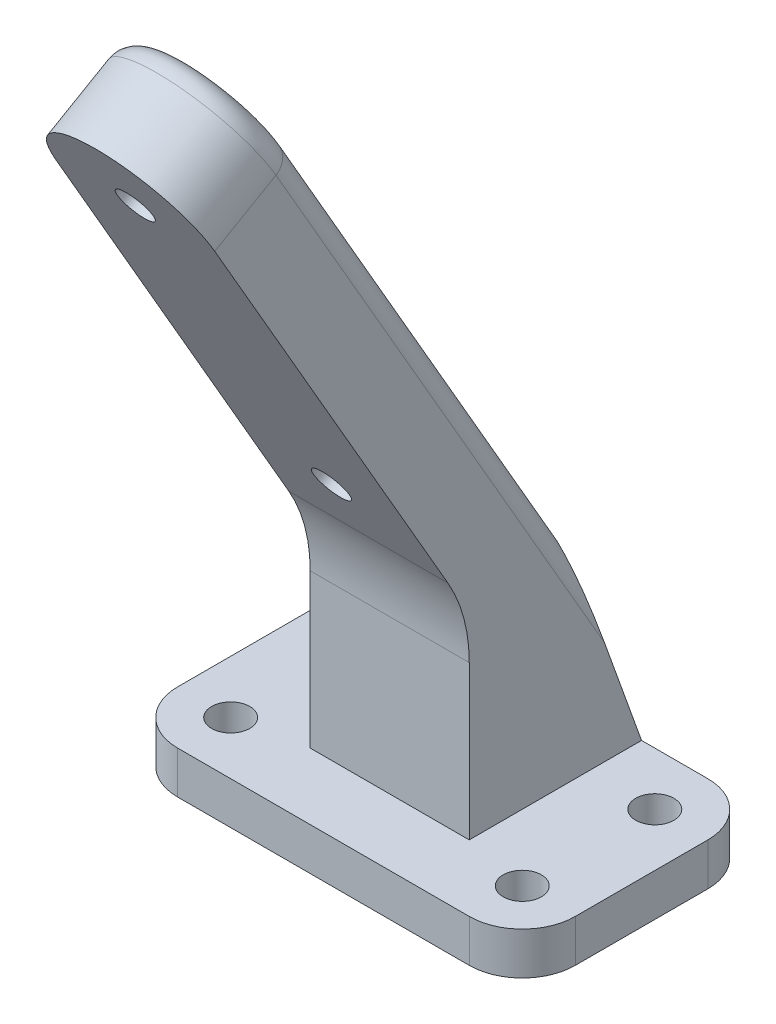
ISO-10303-21;
HEADER;
FILE_DESCRIPTION(('STEP AP214'),'2;1');
FILE_NAME('part.step','',(''),(''),'','','');
FILE_SCHEMA(('AUTOMOTIVE_DESIGN { 1 0 10303 214 1 1 1 1 }'));
ENDSEC;
DATA;
#1=APPLICATION_CONTEXT('core data for automotive mechanical design processes');
#2=APPLICATION_PROTOCOL_DEFINITION('international standard','automotive_design',2000,#1);
#3=PRODUCT_CONTEXT('',#1,'mechanical');
#4=PRODUCT('Part','Part','',(#3));
#5=PRODUCT_RELATED_PRODUCT_CATEGORY('part','',(#4));
#6=PRODUCT_DEFINITION_FORMATION('','',#4);
#7=PRODUCT_DEFINITION_CONTEXT('part definition',#1,'design');
#8=PRODUCT_DEFINITION('design','',#6,#7);
#9=PRODUCT_DEFINITION_SHAPE('','',#8);
#10=(LENGTH_UNIT() NAMED_UNIT(*) SI_UNIT(.MILLI.,.METRE.));
#11=(NAMED_UNIT(*) PLANE_ANGLE_UNIT() SI_UNIT($,.RADIAN.));
#12=(NAMED_UNIT(*) SI_UNIT($,.STERADIAN.) SOLID_ANGLE_UNIT());
#13=UNCERTAINTY_MEASURE_WITH_UNIT(LENGTH_MEASURE(1.E-05),#10,'distance_accuracy_value','');
#14=(GEOMETRIC_REPRESENTATION_CONTEXT(3) GLOBAL_UNCERTAINTY_ASSIGNED_CONTEXT((#13)) GLOBAL_UNIT_ASSIGNED_CONTEXT((#10,
#11,#12)) REPRESENTATION_CONTEXT('',''));
#15=CARTESIAN_POINT('',(0.,0.,0.));
#16=DIRECTION('',(0.,0.,1.));
#17=DIRECTION('',(1.,0.,0.));
#18=AXIS2_PLACEMENT_3D('',#15,#16,#17);
#19=CARTESIAN_POINT('',(11.25,22.5,-16.25));
#20=DIRECTION('',(0.,0.,1.));
#21=DIRECTION('',(1.,0.,0.));
#22=AXIS2_PLACEMENT_3D('',#19,#20,#21);
#23=PLANE('',#22);
#24=DIRECTION('',(0.,-1.,0.));
#25=VECTOR('',#24,1.);
#26=CARTESIAN_POINT('',(15.25,22.5,-16.25));
#27=LINE('',#26,#25);
#28=CARTESIAN_POINT('',(15.25,19.8205080756887,-16.25));
#29=VERTEX_POINT('',#28);
#30=CARTESIAN_POINT('',(15.25,4.,-16.25));
#31=VERTEX_POINT('',#30);
#32=EDGE_CURVE('E196',#29,#31,#27,.T.);
#33=ORIENTED_EDGE('',*,*,#32,.F.);
#34=DIRECTION('',(-1.,0.,0.));
#35=VECTOR('',#34,1.);
#36=CARTESIAN_POINT('',(26.25,19.8205080756887,-16.25));
#37=LINE('',#36,#35);
#38=CARTESIAN_POINT('',(22.25,19.8205080756887,-16.25));
#39=VERTEX_POINT('',#38);
#40=EDGE_CURVE('E303',#29,#39,#37,.F.);
#41=ORIENTED_EDGE('',*,*,#40,.T.);
#42=DIRECTION('',(0.,1.,0.));
#43=VECTOR('',#42,1.);
#44=CARTESIAN_POINT('',(22.25,22.5,-16.25));
#45=LINE('',#44,#43);
#46=CARTESIAN_POINT('',(22.25,4.,-16.25));
#47=VERTEX_POINT('',#46);
#48=EDGE_CURVE('E494',#47,#39,#45,.T.);
#49=ORIENTED_EDGE('',*,*,#48,.F.);
#50=DIRECTION('',(-1.,0.,0.));
#51=VECTOR('',#50,1.);
#52=CARTESIAN_POINT('',(11.25,4.,-16.25));
#53=LINE('',#52,#51);
#54=EDGE_CURVE('E442',#47,#31,#53,.T.);
#55=ORIENTED_EDGE('',*,*,#54,.T.);
#56=EDGE_LOOP('',(#33,#41,#49,#55));
#57=FACE_BOUND('',#56,.T.);
#58=ADVANCED_FACE('F39',(#57),#23,.F.);
#59=CARTESIAN_POINT('',(0.,4.,0.));
#60=DIRECTION('',(0.,-1.,0.));
#61=DIRECTION('',(0.,0.,-1.));
#62=AXIS2_PLACEMENT_3D('',#59,#60,#61);
#63=PLANE('',#62);
#64=DIRECTION('',(0.,0.,-1.));
#65=VECTOR('',#64,1.);
#66=CARTESIAN_POINT('',(15.25,4.,0.));
#67=LINE('',#66,#65);
#68=CARTESIAN_POINT('',(15.25,4.,-22.5));
#69=VERTEX_POINT('',#68);
#70=EDGE_CURVE('E190',#31,#69,#67,.T.);
#71=ORIENTED_EDGE('',*,*,#70,.F.);
#72=ORIENTED_EDGE('',*,*,#54,.F.);
#73=DIRECTION('',(0.,0.,1.));
#74=VECTOR('',#73,1.);
#75=CARTESIAN_POINT('',(22.25,4.,0.));
#76=LINE('',#75,#74);
#77=CARTESIAN_POINT('',(22.25,3.99999999999997,-22.5));
#78=VERTEX_POINT('',#77);
#79=EDGE_CURVE('E225',#78,#47,#76,.T.);
#80=ORIENTED_EDGE('',*,*,#79,.F.);
#81=DIRECTION('',(-1.,0.,0.));
#82=VECTOR('',#81,1.);
#83=CARTESIAN_POINT('',(0.,4.,-22.5));
#84=LINE('',#83,#82);
#85=EDGE_CURVE('E218',#78,#69,#84,.T.);
#86=ORIENTED_EDGE('',*,*,#85,.T.);
#87=EDGE_LOOP('',(#71,#72,#80,#86));
#88=FACE_BOUND('',#87,.T.);
#89=ADVANCED_FACE('F224',(#88),#63,.F.);
#90=DIRECTION('',(1.,0.,0.));
#91=VECTOR('',#90,1.);
#92=CARTESIAN_POINT('',(0.,4.,0.));
#93=LINE('',#92,#91);
#94=CARTESIAN_POINT('',(5.,4.,0.));
#95=VERTEX_POINT('',#94);
#96=CARTESIAN_POINT('',(32.5,4.,0.));
#97=VERTEX_POINT('',#96);
#98=EDGE_CURVE('E430',#95,#97,#93,.T.);
#99=ORIENTED_EDGE('',*,*,#98,.T.);
#100=CARTESIAN_POINT('',(32.5,4.,-5.));
#101=DIRECTION('',(0.,-1.,0.));
#102=DIRECTION('',(0.,0.,-1.));
#103=AXIS2_PLACEMENT_3D('',#100,#101,#102);
#104=CIRCLE('',#103,5.);
#105=CARTESIAN_POINT('',(37.5,4.,-5.));
#106=VERTEX_POINT('',#105);
#107=EDGE_CURVE('E288',#97,#106,#104,.F.);
#108=ORIENTED_EDGE('',*,*,#107,.T.);
#109=DIRECTION('',(0.,0.,-1.));
#110=VECTOR('',#109,1.);
#111=CARTESIAN_POINT('',(37.5,4.,0.));
#112=LINE('',#111,#110);
#113=CARTESIAN_POINT('',(37.5,4.,-17.5));
#114=VERTEX_POINT('',#113);
#115=EDGE_CURVE('E230',#106,#114,#112,.T.);
#116=ORIENTED_EDGE('',*,*,#115,.T.);
#117=CARTESIAN_POINT('',(32.5,4.,-17.5));
#118=DIRECTION('',(0.,-1.,0.));
#119=DIRECTION('',(0.,0.,-1.));
#120=AXIS2_PLACEMENT_3D('',#117,#118,#119);
#121=CIRCLE('',#120,5.);
#122=CARTESIAN_POINT('',(32.5,4.,-22.5));
#123=VERTEX_POINT('',#122);
#124=EDGE_CURVE('E286',#114,#123,#121,.F.);
#125=ORIENTED_EDGE('',*,*,#124,.T.);
#126=CARTESIAN_POINT('',(26.25,3.99999999999997,-22.5));
#127=VERTEX_POINT('',#126);
#128=EDGE_CURVE('E226',#123,#127,#84,.T.);
#129=ORIENTED_EDGE('',*,*,#128,.T.);
#130=DIRECTION('',(0.,0.,-1.));
#131=VECTOR('',#130,1.);
#132=CARTESIAN_POINT('',(26.25,4.,-16.25));
#133=LINE('',#132,#131);
#134=CARTESIAN_POINT('',(26.25,4.,-6.25));
#135=VERTEX_POINT('',#134);
#136=EDGE_CURVE('E444',#135,#127,#133,.T.);
#137=ORIENTED_EDGE('',*,*,#136,.F.);
#138=DIRECTION('',(1.,0.,0.));
#139=VECTOR('',#138,1.);
#140=CARTESIAN_POINT('',(11.25,4.,-6.25));
#141=LINE('',#140,#139);
#142=CARTESIAN_POINT('',(11.25,4.,-6.25));
#143=VERTEX_POINT('',#142);
#144=EDGE_CURVE('E446',#143,#135,#141,.T.);
#145=ORIENTED_EDGE('',*,*,#144,.F.);
#146=DIRECTION('',(0.,0.,1.));
#147=VECTOR('',#146,1.);
#148=CARTESIAN_POINT('',(11.25,4.,-16.25));
#149=LINE('',#148,#147);
#150=CARTESIAN_POINT('',(11.25,4.,-22.5));
#151=VERTEX_POINT('',#150);
#152=EDGE_CURVE('E448',#151,#143,#149,.T.);
#153=ORIENTED_EDGE('',*,*,#152,.F.);
#154=CARTESIAN_POINT('',(5.,4.,-22.5));
#155=VERTEX_POINT('',#154);
#156=EDGE_CURVE('E220',#151,#155,#84,.T.);
#157=ORIENTED_EDGE('',*,*,#156,.T.);
#158=CARTESIAN_POINT('',(5.,4.,-17.5));
#159=DIRECTION('',(0.,-1.,0.));
#160=DIRECTION('',(0.,0.,-1.));
#161=AXIS2_PLACEMENT_3D('',#158,#159,#160);
#162=CIRCLE('',#161,5.);
#163=CARTESIAN_POINT('',(0.,4.,-17.5));
#164=VERTEX_POINT('',#163);
#165=EDGE_CURVE('E282',#155,#164,#162,.F.);
#166=ORIENTED_EDGE('',*,*,#165,.T.);
#167=DIRECTION('',(0.,0.,1.));
#168=VECTOR('',#167,1.);
#169=CARTESIAN_POINT('',(0.,4.,0.));
#170=LINE('',#169,#168);
#171=CARTESIAN_POINT('',(0.,4.,-5.));
#172=VERTEX_POINT('',#171);
#173=EDGE_CURVE('E245',#164,#172,#170,.T.);
#174=ORIENTED_EDGE('',*,*,#173,.T.);
#175=CARTESIAN_POINT('',(5.,4.,-5.));
#176=DIRECTION('',(0.,-1.,0.));
#177=DIRECTION('',(0.,0.,-1.));
#178=AXIS2_PLACEMENT_3D('',#175,#176,#177);
#179=CIRCLE('',#178,5.);
#180=EDGE_CURVE('E284',#172,#95,#179,.F.);
#181=ORIENTED_EDGE('',*,*,#180,.T.);
#182=EDGE_LOOP('',(#99,#108,#116,#125,#129,#137,#145,#153,#157,#166,#174,#181));
#183=FACE_BOUND('',#182,.T.);
#184=CARTESIAN_POINT('',(5.,4.,-17.5));
#185=DIRECTION('',(0.,1.,0.));
#186=DIRECTION('',(0.,0.,1.));
#187=AXIS2_PLACEMENT_3D('',#184,#185,#186);
#188=CIRCLE('',#187,1.8);
#189=CARTESIAN_POINT('',(5.,4.,-15.7));
#190=VERTEX_POINT('',#189);
#191=EDGE_CURVE('E469',#190,#190,#188,.T.);
#192=ORIENTED_EDGE('',*,*,#191,.F.);
#193=EDGE_LOOP('',(#192));
#194=FACE_BOUND('',#193,.T.);
#195=CARTESIAN_POINT('',(5.,4.,-4.99999999999999));
#196=DIRECTION('',(0.,1.,0.));
#197=DIRECTION('',(0.,0.,-1.));
#198=AXIS2_PLACEMENT_3D('',#195,#196,#197);
#199=CIRCLE('',#198,1.8);
#200=CARTESIAN_POINT('',(5.,4.,-6.79999999999999));
#201=VERTEX_POINT('',#200);
#202=EDGE_CURVE('E475',#201,#201,#199,.T.);
#203=ORIENTED_EDGE('',*,*,#202,.F.);
#204=EDGE_LOOP('',(#203));
#205=FACE_BOUND('',#204,.T.);
#206=CARTESIAN_POINT('',(32.5,4.,-17.5));
#207=DIRECTION('',(0.,1.,0.));
#208=DIRECTION('',(0.,0.,-1.));
#209=AXIS2_PLACEMENT_3D('',#206,#207,#208);
#210=CIRCLE('',#209,1.8);
#211=CARTESIAN_POINT('',(32.5,4.,-19.3));
#212=VERTEX_POINT('',#211);
#213=EDGE_CURVE('E488',#212,#212,#210,.T.);
#214=ORIENTED_EDGE('',*,*,#213,.F.);
#215=EDGE_LOOP('',(#214));
#216=FACE_BOUND('',#215,.T.);
#217=CARTESIAN_POINT('',(32.5,4.,-4.99999999999999));
#218=DIRECTION('',(0.,1.,0.));
#219=DIRECTION('',(0.,0.,1.));
#220=AXIS2_PLACEMENT_3D('',#217,#218,#219);
#221=CIRCLE('',#220,1.8);
#222=CARTESIAN_POINT('',(32.5,4.,-3.19999999999999));
#223=VERTEX_POINT('',#222);
#224=EDGE_CURVE('E482',#223,#223,#221,.T.);
#225=ORIENTED_EDGE('',*,*,#224,.F.);
#226=EDGE_LOOP('',(#225));
#227=FACE_BOUND('',#226,.T.);
#228=ADVANCED_FACE('F366',(#183,#194,#205,#216,#227),#63,.F.);
#229=CARTESIAN_POINT('',(0.,4.,0.));
#230=DIRECTION('',(1.,0.,0.));
#231=DIRECTION('',(0.,0.,-1.));
#232=AXIS2_PLACEMENT_3D('',#229,#230,#231);
#233=PLANE('',#232);
#234=DIRECTION('',(0.,0.,1.));
#235=VECTOR('',#234,1.);
#236=CARTESIAN_POINT('',(0.,0.,0.));
#237=LINE('',#236,#235);
#238=CARTESIAN_POINT('',(0.,0.,-17.5));
#239=VERTEX_POINT('',#238);
#240=CARTESIAN_POINT('',(0.,0.,-5.));
#241=VERTEX_POINT('',#240);
#242=EDGE_CURVE('E234',#239,#241,#237,.T.);
#243=ORIENTED_EDGE('',*,*,#242,.T.);
#244=DIRECTION('',(0.,-1.,0.));
#245=VECTOR('',#244,1.);
#246=CARTESIAN_POINT('',(0.,4.,-5.));
#247=LINE('',#246,#245);
#248=EDGE_CURVE('E298',#241,#172,#247,.F.);
#249=ORIENTED_EDGE('',*,*,#248,.T.);
#250=ORIENTED_EDGE('',*,*,#173,.F.);
#251=DIRECTION('',(0.,-1.,0.));
#252=VECTOR('',#251,1.);
#253=CARTESIAN_POINT('',(0.,4.,-17.5));
#254=LINE('',#253,#252);
#255=EDGE_CURVE('E295',#164,#239,#254,.T.);
#256=ORIENTED_EDGE('',*,*,#255,.T.);
#257=EDGE_LOOP('',(#243,#249,#250,#256));
#258=FACE_BOUND('',#257,.T.);
#259=ADVANCED_FACE('F386',(#258),#233,.F.);
#260=CARTESIAN_POINT('',(0.,4.,0.));
#261=DIRECTION('',(0.,0.,-1.));
#262=DIRECTION('',(-1.,0.,0.));
#263=AXIS2_PLACEMENT_3D('',#260,#261,#262);
#264=PLANE('',#263);
#265=DIRECTION('',(1.,0.,0.));
#266=VECTOR('',#265,1.);
#267=CARTESIAN_POINT('',(0.,0.,0.));
#268=LINE('',#267,#266);
#269=CARTESIAN_POINT('',(5.,0.,0.));
#270=VERTEX_POINT('',#269);
#271=CARTESIAN_POINT('',(32.5,0.,0.));
#272=VERTEX_POINT('',#271);
#273=EDGE_CURVE('E237',#270,#272,#268,.T.);
#274=ORIENTED_EDGE('',*,*,#273,.T.);
#275=DIRECTION('',(0.,-1.,0.));
#276=VECTOR('',#275,1.);
#277=CARTESIAN_POINT('',(32.5,4.,0.));
#278=LINE('',#277,#276);
#279=EDGE_CURVE('E279',#272,#97,#278,.F.);
#280=ORIENTED_EDGE('',*,*,#279,.T.);
#281=ORIENTED_EDGE('',*,*,#98,.F.);
#282=DIRECTION('',(0.,-1.,0.));
#283=VECTOR('',#282,1.);
#284=CARTESIAN_POINT('',(5.,4.,0.));
#285=LINE('',#284,#283);
#286=EDGE_CURVE('E276',#95,#270,#285,.T.);
#287=ORIENTED_EDGE('',*,*,#286,.T.);
#288=EDGE_LOOP('',(#274,#280,#281,#287));
#289=FACE_BOUND('',#288,.T.);
#290=ADVANCED_FACE('F396',(#289),#264,.F.);
#291=CARTESIAN_POINT('',(37.5,4.,0.));
#292=DIRECTION('',(-1.,0.,0.));
#293=DIRECTION('',(0.,0.,1.));
#294=AXIS2_PLACEMENT_3D('',#291,#292,#293);
#295=PLANE('',#294);
#296=ORIENTED_EDGE('',*,*,#115,.F.);
#297=DIRECTION('',(0.,-1.,0.));
#298=VECTOR('',#297,1.);
#299=CARTESIAN_POINT('',(37.5,4.,-5.));
#300=LINE('',#299,#298);
#301=CARTESIAN_POINT('',(37.5,0.,-5.));
#302=VERTEX_POINT('',#301);
#303=EDGE_CURVE('E263',#106,#302,#300,.T.);
#304=ORIENTED_EDGE('',*,*,#303,.T.);
#305=DIRECTION('',(0.,0.,-1.));
#306=VECTOR('',#305,1.);
#307=CARTESIAN_POINT('',(37.5,0.,0.));
#308=LINE('',#307,#306);
#309=CARTESIAN_POINT('',(37.5,0.,-17.5));
#310=VERTEX_POINT('',#309);
#311=EDGE_CURVE('E240',#302,#310,#308,.T.);
#312=ORIENTED_EDGE('',*,*,#311,.T.);
#313=DIRECTION('',(0.,-1.,0.));
#314=VECTOR('',#313,1.);
#315=CARTESIAN_POINT('',(37.5,4.,-17.5));
#316=LINE('',#315,#314);
#317=EDGE_CURVE('E261',#310,#114,#316,.F.);
#318=ORIENTED_EDGE('',*,*,#317,.T.);
#319=EDGE_LOOP('',(#296,#304,#312,#318));
#320=FACE_BOUND('',#319,.T.);
#321=ADVANCED_FACE('F393',(#320),#295,.F.);
#322=CARTESIAN_POINT('',(0.,4.,-22.5));
#323=DIRECTION('',(0.,0.,1.));
#324=DIRECTION('',(1.,0.,0.));
#325=AXIS2_PLACEMENT_3D('',#322,#323,#324);
#326=PLANE('',#325);
#327=ORIENTED_EDGE('',*,*,#156,.F.);
#328=DIRECTION('',(1.,0.,0.));
#329=VECTOR('',#328,1.);
#330=CARTESIAN_POINT('',(0.,4.,-22.5));
#331=LINE('',#330,#329);
#332=EDGE_CURVE('E201',#69,#151,#331,.F.);
#333=ORIENTED_EDGE('',*,*,#332,.F.);
#334=ORIENTED_EDGE('',*,*,#85,.F.);
#335=DIRECTION('',(-1.,0.,0.));
#336=VECTOR('',#335,1.);
#337=CARTESIAN_POINT('',(0.,3.99999999999997,-22.5));
#338=LINE('',#337,#336);
#339=EDGE_CURVE('E479',#127,#78,#338,.T.);
#340=ORIENTED_EDGE('',*,*,#339,.F.);
#341=ORIENTED_EDGE('',*,*,#128,.F.);
#342=DIRECTION('',(0.,-1.,0.));
#343=VECTOR('',#342,1.);
#344=CARTESIAN_POINT('',(32.5,4.,-22.5));
#345=LINE('',#344,#343);
#346=CARTESIAN_POINT('',(32.5,0.,-22.5));
#347=VERTEX_POINT('',#346);
#348=EDGE_CURVE('E292',#123,#347,#345,.T.);
#349=ORIENTED_EDGE('',*,*,#348,.T.);
#350=DIRECTION('',(-1.,0.,0.));
#351=VECTOR('',#350,1.);
#352=CARTESIAN_POINT('',(0.,0.,-22.5));
#353=LINE('',#352,#351);
#354=CARTESIAN_POINT('',(5.,0.,-22.5));
#355=VERTEX_POINT('',#354);
#356=EDGE_CURVE('E243',#347,#355,#353,.T.);
#357=ORIENTED_EDGE('',*,*,#356,.T.);
#358=DIRECTION('',(0.,-1.,0.));
#359=VECTOR('',#358,1.);
#360=CARTESIAN_POINT('',(5.,4.,-22.5));
#361=LINE('',#360,#359);
#362=EDGE_CURVE('E290',#355,#155,#361,.F.);
#363=ORIENTED_EDGE('',*,*,#362,.T.);
#364=EDGE_LOOP('',(#327,#333,#334,#340,#341,#349,#357,#363));
#365=FACE_BOUND('',#364,.T.);
#366=ADVANCED_FACE('F216',(#365),#326,.F.);
#367=CARTESIAN_POINT('',(0.,0.,0.));
#368=DIRECTION('',(0.,-1.,0.));
#369=DIRECTION('',(0.,0.,-1.));
#370=AXIS2_PLACEMENT_3D('',#367,#368,#369);
#371=PLANE('',#370);
#372=CARTESIAN_POINT('',(5.,0.,-17.5));
#373=DIRECTION('',(0.,-1.,0.));
#374=DIRECTION('',(0.,0.,-1.));
#375=AXIS2_PLACEMENT_3D('',#372,#373,#374);
#376=CIRCLE('',#375,5.);
#377=EDGE_CURVE('E266',#239,#355,#376,.T.);
#378=ORIENTED_EDGE('',*,*,#377,.T.);
#379=ORIENTED_EDGE('',*,*,#356,.F.);
#380=CARTESIAN_POINT('',(32.5,0.,-17.5));
#381=DIRECTION('',(0.,-1.,0.));
#382=DIRECTION('',(0.,0.,-1.));
#383=AXIS2_PLACEMENT_3D('',#380,#381,#382);
#384=CIRCLE('',#383,5.);
#385=EDGE_CURVE('E271',#347,#310,#384,.T.);
#386=ORIENTED_EDGE('',*,*,#385,.T.);
#387=ORIENTED_EDGE('',*,*,#311,.F.);
#388=CARTESIAN_POINT('',(32.5,0.,-5.));
#389=DIRECTION('',(0.,-1.,0.));
#390=DIRECTION('',(0.,0.,-1.));
#391=AXIS2_PLACEMENT_3D('',#388,#389,#390);
#392=CIRCLE('',#391,5.);
#393=EDGE_CURVE('E273',#302,#272,#392,.T.);
#394=ORIENTED_EDGE('',*,*,#393,.T.);
#395=ORIENTED_EDGE('',*,*,#273,.F.);
#396=CARTESIAN_POINT('',(5.,0.,-5.));
#397=DIRECTION('',(0.,-1.,0.));
#398=DIRECTION('',(0.,0.,-1.));
#399=AXIS2_PLACEMENT_3D('',#396,#397,#398);
#400=CIRCLE('',#399,5.);
#401=EDGE_CURVE('E269',#270,#241,#400,.T.);
#402=ORIENTED_EDGE('',*,*,#401,.T.);
#403=ORIENTED_EDGE('',*,*,#242,.F.);
#404=EDGE_LOOP('',(#378,#379,#386,#387,#394,#395,#402,#403));
#405=FACE_BOUND('',#404,.T.);
#406=CARTESIAN_POINT('',(5.,0.,-17.5));
#407=DIRECTION('',(0.,1.,0.));
#408=DIRECTION('',(0.,0.,1.));
#409=AXIS2_PLACEMENT_3D('',#406,#407,#408);
#410=CIRCLE('',#409,1.8);
#411=CARTESIAN_POINT('',(5.,0.,-15.7));
#412=VERTEX_POINT('',#411);
#413=EDGE_CURVE('E466',#412,#412,#410,.T.);
#414=ORIENTED_EDGE('',*,*,#413,.T.);
#415=EDGE_LOOP('',(#414));
#416=FACE_BOUND('',#415,.T.);
#417=CARTESIAN_POINT('',(5.,0.,-4.99999999999999));
#418=DIRECTION('',(0.,1.,0.));
#419=DIRECTION('',(0.,0.,-1.));
#420=AXIS2_PLACEMENT_3D('',#417,#418,#419);
#421=CIRCLE('',#420,1.8);
#422=CARTESIAN_POINT('',(5.,0.,-6.79999999999999));
#423=VERTEX_POINT('',#422);
#424=EDGE_CURVE('E478',#423,#423,#421,.T.);
#425=ORIENTED_EDGE('',*,*,#424,.T.);
#426=EDGE_LOOP('',(#425));
#427=FACE_BOUND('',#426,.T.);
#428=CARTESIAN_POINT('',(32.5,0.,-17.5));
#429=DIRECTION('',(0.,1.,0.));
#430=DIRECTION('',(0.,0.,-1.));
#431=AXIS2_PLACEMENT_3D('',#428,#429,#430);
#432=CIRCLE('',#431,1.8);
#433=CARTESIAN_POINT('',(32.5,0.,-19.3));
#434=VERTEX_POINT('',#433);
#435=EDGE_CURVE('E472',#434,#434,#432,.T.);
#436=ORIENTED_EDGE('',*,*,#435,.T.);
#437=EDGE_LOOP('',(#436));
#438=FACE_BOUND('',#437,.T.);
#439=CARTESIAN_POINT('',(32.5,0.,-4.99999999999999));
#440=DIRECTION('',(0.,1.,0.));
#441=DIRECTION('',(0.,0.,1.));
#442=AXIS2_PLACEMENT_3D('',#439,#440,#441);
#443=CIRCLE('',#442,1.8);
#444=CARTESIAN_POINT('',(32.5,0.,-3.19999999999999));
#445=VERTEX_POINT('',#444);
#446=EDGE_CURVE('E485',#445,#445,#443,.T.);
#447=ORIENTED_EDGE('',*,*,#446,.T.);
#448=EDGE_LOOP('',(#447));
#449=FACE_BOUND('',#448,.T.);
#450=ADVANCED_FACE('F382',(#405,#416,#427,#438,#449),#371,.T.);
#451=CARTESIAN_POINT('',(11.25,22.5,-16.25));
#452=DIRECTION('',(1.,0.,0.));
#453=DIRECTION('',(0.,0.,-1.));
#454=AXIS2_PLACEMENT_3D('',#451,#452,#453);
#455=PLANE('',#454);
#456=DIRECTION('',(0.,-0.500000000000004,0.866025403784436));
#457=VECTOR('',#456,1.);
#458=CARTESIAN_POINT('',(11.25,64.0692193816529,17.7500000000002));
#459=LINE('',#458,#457);
#460=CARTESIAN_POINT('',(11.25,67.3993464005752,11.9820508075691));
#461=VERTEX_POINT('',#460);
#462=CARTESIAN_POINT('',(11.25,64.0692193816529,17.7500000000002));
#463=VERTEX_POINT('',#462);
#464=EDGE_CURVE('E455',#461,#463,#459,.T.);
#465=ORIENTED_EDGE('',*,*,#464,.F.);
#466=DIRECTION('',(0.,0.866025403784436,0.500000000000004));
#467=VECTOR('',#466,1.);
#468=CARTESIAN_POINT('',(11.25,23.8205080756888,-13.1782032302755));
#469=LINE('',#468,#467);
#470=CARTESIAN_POINT('',(11.25,13.7517606181265,-18.9913972853015));
#471=VERTEX_POINT('',#470);
#472=EDGE_CURVE('E320',#461,#471,#469,.F.);
#473=ORIENTED_EDGE('',*,*,#472,.T.);
#474=DIRECTION('',(0.,0.940949854760072,0.338545965604375));
#475=VECTOR('',#474,1.);
#476=CARTESIAN_POINT('',(11.25,4.,-22.5));
#477=LINE('',#476,#475);
#478=EDGE_CURVE('E211',#151,#471,#477,.T.);
#479=ORIENTED_EDGE('',*,*,#478,.F.);
#480=ORIENTED_EDGE('',*,*,#152,.T.);
#481=DIRECTION('',(0.,-1.,0.));
#482=VECTOR('',#481,1.);
#483=CARTESIAN_POINT('',(11.25,22.5,-6.25));
#484=LINE('',#483,#482);
#485=CARTESIAN_POINT('',(11.25,18.4807621135331,-6.25));
#486=VERTEX_POINT('',#485);
#487=EDGE_CURVE('E238',#486,#143,#484,.T.);
#488=ORIENTED_EDGE('',*,*,#487,.F.);
#489=CARTESIAN_POINT('',(11.25,18.4807621135331,8.75));
#490=DIRECTION('',(1.,0.,0.));
#491=DIRECTION('',(0.,0.,-1.));
#492=AXIS2_PLACEMENT_3D('',#489,#490,#491);
#493=CIRCLE('',#492,15.);
#494=CARTESIAN_POINT('',(11.25,25.9807621135332,-4.24038105676654));
#495=VERTEX_POINT('',#494);
#496=EDGE_CURVE('E259',#486,#495,#493,.T.);
#497=ORIENTED_EDGE('',*,*,#496,.T.);
#498=DIRECTION('',(0.,-0.866025403784436,-0.500000000000004));
#499=VECTOR('',#498,1.);
#500=CARTESIAN_POINT('',(11.25,22.5,-6.25));
#501=LINE('',#500,#499);
#502=EDGE_CURVE('E451',#463,#495,#501,.T.);
#503=ORIENTED_EDGE('',*,*,#502,.F.);
#504=EDGE_LOOP('',(#465,#473,#479,#480,#488,#497,#503));
#505=FACE_BOUND('',#504,.T.);
#506=ADVANCED_FACE('F379',(#505),#455,.F.);
#507=CARTESIAN_POINT('',(11.25,22.5,-6.25));
#508=DIRECTION('',(0.,0.,-1.));
#509=DIRECTION('',(-1.,0.,0.));
#510=AXIS2_PLACEMENT_3D('',#507,#508,#509);
#511=PLANE('',#510);
#512=ORIENTED_EDGE('',*,*,#144,.T.);
#513=DIRECTION('',(0.,-1.,0.));
#514=VECTOR('',#513,1.);
#515=CARTESIAN_POINT('',(26.25,22.5,-6.25));
#516=LINE('',#515,#514);
#517=CARTESIAN_POINT('',(26.25,18.4807621135331,-6.25));
#518=VERTEX_POINT('',#517);
#519=EDGE_CURVE('E439',#518,#135,#516,.T.);
#520=ORIENTED_EDGE('',*,*,#519,.F.);
#521=DIRECTION('',(1.,0.,0.));
#522=VECTOR('',#521,1.);
#523=CARTESIAN_POINT('',(11.25,18.4807621135331,-6.25));
#524=LINE('',#523,#522);
#525=EDGE_CURVE('E255',#518,#486,#524,.F.);
#526=ORIENTED_EDGE('',*,*,#525,.T.);
#527=ORIENTED_EDGE('',*,*,#487,.T.);
#528=EDGE_LOOP('',(#512,#520,#526,#527));
#529=FACE_BOUND('',#528,.T.);
#530=ADVANCED_FACE('F376',(#529),#511,.F.);
#531=CARTESIAN_POINT('',(26.25,22.5,-16.25));
#532=DIRECTION('',(-1.,0.,0.));
#533=DIRECTION('',(0.,0.,1.));
#534=AXIS2_PLACEMENT_3D('',#531,#532,#533);
#535=PLANE('',#534);
#536=DIRECTION('',(0.,0.941051653318184,0.338262894487576));
#537=VECTOR('',#536,1.);
#538=CARTESIAN_POINT('',(26.25,4.,-22.5));
#539=LINE('',#538,#537);
#540=CARTESIAN_POINT('',(26.25,13.7365567225734,-19.0001752584918));
#541=VERTEX_POINT('',#540);
#542=EDGE_CURVE('E498',#127,#541,#539,.T.);
#543=ORIENTED_EDGE('',*,*,#542,.T.);
#544=DIRECTION('',(0.,0.866025403784436,0.500000000000004));
#545=VECTOR('',#544,1.);
#546=CARTESIAN_POINT('',(26.25,67.3993464005752,11.9820508075691));
#547=LINE('',#546,#545);
#548=CARTESIAN_POINT('',(26.25,67.3993464005752,11.9820508075691));
#549=VERTEX_POINT('',#548);
#550=EDGE_CURVE('E49',#541,#549,#547,.T.);
#551=ORIENTED_EDGE('',*,*,#550,.T.);
#552=DIRECTION('',(0.,-0.500000000000004,0.866025403784436));
#553=VECTOR('',#552,1.);
#554=CARTESIAN_POINT('',(26.25,64.0692193816529,17.7500000000002));
#555=LINE('',#554,#553);
#556=CARTESIAN_POINT('',(26.25,64.0692193816529,17.7500000000002));
#557=VERTEX_POINT('',#556);
#558=EDGE_CURVE('E456',#549,#557,#555,.T.);
#559=ORIENTED_EDGE('',*,*,#558,.T.);
#560=DIRECTION('',(0.,-0.866025403784436,-0.500000000000004));
#561=VECTOR('',#560,1.);
#562=CARTESIAN_POINT('',(26.25,22.5,-6.25));
#563=LINE('',#562,#561);
#564=CARTESIAN_POINT('',(26.25,25.9807621135332,-4.24038105676654));
#565=VERTEX_POINT('',#564);
#566=EDGE_CURVE('E452',#557,#565,#563,.T.);
#567=ORIENTED_EDGE('',*,*,#566,.T.);
#568=CARTESIAN_POINT('',(26.25,18.4807621135331,8.75));
#569=DIRECTION('',(-1.,0.,0.));
#570=DIRECTION('',(0.,0.,1.));
#571=AXIS2_PLACEMENT_3D('',#568,#569,#570);
#572=CIRCLE('',#571,15.);
#573=EDGE_CURVE('E257',#565,#518,#572,.T.);
#574=ORIENTED_EDGE('',*,*,#573,.T.);
#575=ORIENTED_EDGE('',*,*,#519,.T.);
#576=ORIENTED_EDGE('',*,*,#136,.T.);
#577=EDGE_LOOP('',(#543,#551,#559,#567,#574,#575,#576));
#578=FACE_BOUND('',#577,.T.);
#579=ADVANCED_FACE('F372',(#578),#535,.F.);
#580=CARTESIAN_POINT('',(11.25,22.5,-6.25));
#581=DIRECTION('',(0.,-0.500000000000004,0.866025403784436));
#582=DIRECTION('',(0.,-0.866025403784436,-0.500000000000004));
#583=AXIS2_PLACEMENT_3D('',#580,#581,#582);
#584=PLANE('',#583);
#585=DIRECTION('',(1.,0.,0.));
#586=VECTOR('',#585,1.);
#587=CARTESIAN_POINT('',(11.25,25.9807621135332,-4.24038105676654));
#588=LINE('',#587,#586);
#589=EDGE_CURVE('E229',#495,#565,#588,.T.);
#590=ORIENTED_EDGE('',*,*,#589,.T.);
#591=ORIENTED_EDGE('',*,*,#566,.F.);
#592=CARTESIAN_POINT('',(18.75,64.0692193816529,17.7500000000002));
#593=DIRECTION('',(0.,-0.500000000000004,0.866025403784436));
#594=DIRECTION('',(0.,-0.866025403784436,-0.500000000000004));
#595=AXIS2_PLACEMENT_3D('',#592,#593,#594);
#596=CIRCLE('',#595,7.5);
#597=EDGE_CURVE('E253',#557,#463,#596,.T.);
#598=ORIENTED_EDGE('',*,*,#597,.T.);
#599=ORIENTED_EDGE('',*,*,#502,.T.);
#600=EDGE_LOOP('',(#590,#591,#598,#599));
#601=FACE_BOUND('',#600,.T.);
#602=CARTESIAN_POINT('',(18.75,64.0692193816529,17.7500000000002));
#603=DIRECTION('',(0.,-0.500000000000004,0.866025403784436));
#604=DIRECTION('',(0.,-0.866025403784436,-0.500000000000004));
#605=AXIS2_PLACEMENT_3D('',#602,#603,#604);
#606=CIRCLE('',#605,1.7);
#607=CARTESIAN_POINT('',(18.75,62.5969761952194,16.9000000000002));
#608=VERTEX_POINT('',#607);
#609=EDGE_CURVE('E250',#608,#608,#606,.T.);
#610=ORIENTED_EDGE('',*,*,#609,.F.);
#611=EDGE_LOOP('',(#610));
#612=FACE_BOUND('',#611,.T.);
#613=CARTESIAN_POINT('',(18.75,32.0262794416288,-0.749999999999966));
#614=DIRECTION('',(0.,-0.500000000000004,0.866025403784436));
#615=DIRECTION('',(0.,-0.866025403784436,-0.500000000000004));
#616=AXIS2_PLACEMENT_3D('',#613,#614,#615);
#617=CIRCLE('',#616,1.7);
#618=CARTESIAN_POINT('',(18.75,30.5540362551953,-1.59999999999997));
#619=VERTEX_POINT('',#618);
#620=EDGE_CURVE('E463',#619,#619,#617,.T.);
#621=ORIENTED_EDGE('',*,*,#620,.F.);
#622=EDGE_LOOP('',(#621));
#623=FACE_BOUND('',#622,.T.);
#624=ADVANCED_FACE('F375',(#601,#612,#623),#584,.T.);
#625=CARTESIAN_POINT('',(11.25,22.5,-16.25));
#626=DIRECTION('',(0.,0.500000000000004,-0.866025403784436));
#627=DIRECTION('',(0.,0.866025403784436,0.500000000000004));
#628=AXIS2_PLACEMENT_3D('',#625,#626,#627);
#629=PLANE('',#628);
#630=DIRECTION('',(-1.,0.,0.));
#631=VECTOR('',#630,1.);
#632=CARTESIAN_POINT('',(11.25,24.8205080756888,-14.9102540378444));
#633=LINE('',#632,#631);
#634=CARTESIAN_POINT('',(24.25,24.8205080756888,-14.9102540378444));
#635=VERTEX_POINT('',#634);
#636=CARTESIAN_POINT('',(13.25,24.8205080756888,-14.9102540378444));
#637=VERTEX_POINT('',#636);
#638=EDGE_CURVE('E300',#635,#637,#633,.T.);
#639=ORIENTED_EDGE('',*,*,#638,.T.);
#640=DIRECTION('',(0.,0.866025403784436,0.500000000000004));
#641=VECTOR('',#640,1.);
#642=CARTESIAN_POINT('',(13.25,68.3993464005752,10.2500000000002));
#643=LINE('',#642,#641);
#644=CARTESIAN_POINT('',(13.25,68.3993464005752,10.2500000000002));
#645=VERTEX_POINT('',#644);
#646=EDGE_CURVE('E317',#637,#645,#643,.T.);
#647=ORIENTED_EDGE('',*,*,#646,.T.);
#648=CARTESIAN_POINT('',(18.75,68.3993464005751,10.2500000000002));
#649=DIRECTION('',(0.,0.500000000000004,-0.866025403784436));
#650=DIRECTION('',(0.,0.866025403784436,0.500000000000004));
#651=AXIS2_PLACEMENT_3D('',#648,#649,#650);
#652=CIRCLE('',#651,5.5);
#653=CARTESIAN_POINT('',(24.25,68.3993464005752,10.2500000000002));
#654=VERTEX_POINT('',#653);
#655=EDGE_CURVE('E315',#645,#654,#652,.T.);
#656=ORIENTED_EDGE('',*,*,#655,.T.);
#657=DIRECTION('',(0.,0.866025403784436,0.500000000000004));
#658=VECTOR('',#657,1.);
#659=CARTESIAN_POINT('',(24.25,24.8205080756888,-14.9102540378444));
#660=LINE('',#659,#658);
#661=EDGE_CURVE('E313',#654,#635,#660,.F.);
#662=ORIENTED_EDGE('',*,*,#661,.T.);
#663=EDGE_LOOP('',(#639,#647,#656,#662));
#664=FACE_BOUND('',#663,.T.);
#665=CARTESIAN_POINT('',(18.75,68.3993464005752,10.2500000000002));
#666=DIRECTION('',(0.,0.500000000000004,-0.866025403784436));
#667=DIRECTION('',(0.,0.866025403784436,0.500000000000004));
#668=AXIS2_PLACEMENT_3D('',#665,#666,#667);
#669=CIRCLE('',#668,1.7);
#670=CARTESIAN_POINT('',(18.75,69.8715895870087,11.1000000000003));
#671=VERTEX_POINT('',#670);
#672=EDGE_CURVE('E249',#671,#671,#669,.T.);
#673=ORIENTED_EDGE('',*,*,#672,.F.);
#674=EDGE_LOOP('',(#673));
#675=FACE_BOUND('',#674,.T.);
#676=CARTESIAN_POINT('',(18.75,36.356406460551,-8.24999999999991));
#677=DIRECTION('',(0.,0.500000000000004,-0.866025403784436));
#678=DIRECTION('',(0.,0.866025403784436,0.500000000000004));
#679=AXIS2_PLACEMENT_3D('',#676,#677,#678);
#680=CIRCLE('',#679,1.7);
#681=CARTESIAN_POINT('',(18.75,37.8286496469846,-7.39999999999991));
#682=VERTEX_POINT('',#681);
#683=EDGE_CURVE('E246',#682,#682,#680,.T.);
#684=ORIENTED_EDGE('',*,*,#683,.F.);
#685=EDGE_LOOP('',(#684));
#686=FACE_BOUND('',#685,.T.);
#687=ADVANCED_FACE('F370',(#664,#675,#686),#629,.T.);
#688=CARTESIAN_POINT('',(18.75,68.399346401653,10.2499999981334));
#689=DIRECTION('',(0.,-0.500000000000004,0.866025403784436));
#690=DIRECTION('',(0.,-0.866025403784436,-0.500000000000004));
#691=AXIS2_PLACEMENT_3D('',#688,#689,#690);
#692=CYLINDRICAL_SURFACE('',#691,7.5);
#693=ORIENTED_EDGE('',*,*,#558,.F.);
#694=CARTESIAN_POINT('',(18.75,67.3993464005751,11.9820508075691));
#695=DIRECTION('',(0.,0.500000000000004,-0.866025403784436));
#696=DIRECTION('',(0.,0.866025403784436,0.500000000000004));
#697=AXIS2_PLACEMENT_3D('',#694,#695,#696);
#698=CIRCLE('',#697,7.5);
#699=EDGE_CURVE('E509',#549,#461,#698,.F.);
#700=ORIENTED_EDGE('',*,*,#699,.T.);
#701=ORIENTED_EDGE('',*,*,#464,.T.);
#702=ORIENTED_EDGE('',*,*,#597,.F.);
#703=EDGE_LOOP('',(#693,#700,#701,#702));
#704=FACE_BOUND('',#703,.T.);
#705=ADVANCED_FACE('F559',(#704),#692,.T.);
#706=CARTESIAN_POINT('',(18.75,37.0262794416288,-9.41025403784433));
#707=DIRECTION('',(0.,-0.500000000000004,0.866025403784436));
#708=DIRECTION('',(0.,-0.866025403784436,-0.500000000000004));
#709=AXIS2_PLACEMENT_3D('',#706,#707,#708);
#710=CYLINDRICAL_SURFACE('',#709,1.7);
#711=ORIENTED_EDGE('',*,*,#683,.T.);
#712=EDGE_LOOP('',(#711));
#713=FACE_BOUND('',#712,.T.);
#714=ORIENTED_EDGE('',*,*,#620,.T.);
#715=EDGE_LOOP('',(#714));
#716=FACE_BOUND('',#715,.T.);
#717=ADVANCED_FACE('F555',(#713,#716),#710,.F.);
#718=CARTESIAN_POINT('',(18.75,69.069219381653,9.08974596215582));
#719=DIRECTION('',(0.,-0.500000000000004,0.866025403784436));
#720=DIRECTION('',(0.,-0.866025403784436,-0.500000000000004));
#721=AXIS2_PLACEMENT_3D('',#718,#719,#720);
#722=CYLINDRICAL_SURFACE('',#721,1.7);
#723=ORIENTED_EDGE('',*,*,#672,.T.);
#724=EDGE_LOOP('',(#723));
#725=FACE_BOUND('',#724,.T.);
#726=ORIENTED_EDGE('',*,*,#609,.T.);
#727=EDGE_LOOP('',(#726));
#728=FACE_BOUND('',#727,.T.);
#729=ADVANCED_FACE('F408',(#725,#728),#722,.F.);
#730=CARTESIAN_POINT('',(11.25,18.4807621135331,8.75));
#731=DIRECTION('',(1.,0.,0.));
#732=DIRECTION('',(0.,0.,-1.));
#733=AXIS2_PLACEMENT_3D('',#730,#731,#732);
#734=CYLINDRICAL_SURFACE('',#733,15.);
#735=ORIENTED_EDGE('',*,*,#496,.F.);
#736=ORIENTED_EDGE('',*,*,#525,.F.);
#737=ORIENTED_EDGE('',*,*,#573,.F.);
#738=ORIENTED_EDGE('',*,*,#589,.F.);
#739=EDGE_LOOP('',(#735,#736,#737,#738));
#740=FACE_BOUND('',#739,.T.);
#741=ADVANCED_FACE('F404',(#740),#734,.F.);
#742=CARTESIAN_POINT('',(32.5,4.,-5.));
#743=DIRECTION('',(0.,-1.,0.));
#744=DIRECTION('',(0.,0.,-1.));
#745=AXIS2_PLACEMENT_3D('',#742,#743,#744);
#746=CYLINDRICAL_SURFACE('',#745,5.);
#747=ORIENTED_EDGE('',*,*,#107,.F.);
#748=ORIENTED_EDGE('',*,*,#279,.F.);
#749=ORIENTED_EDGE('',*,*,#393,.F.);
#750=ORIENTED_EDGE('',*,*,#303,.F.);
#751=EDGE_LOOP('',(#747,#748,#749,#750));
#752=FACE_BOUND('',#751,.T.);
#753=ADVANCED_FACE('F407',(#752),#746,.T.);
#754=CARTESIAN_POINT('',(32.5,4.,-17.5));
#755=DIRECTION('',(0.,-1.,0.));
#756=DIRECTION('',(0.,0.,-1.));
#757=AXIS2_PLACEMENT_3D('',#754,#755,#756);
#758=CYLINDRICAL_SURFACE('',#757,5.);
#759=ORIENTED_EDGE('',*,*,#124,.F.);
#760=ORIENTED_EDGE('',*,*,#317,.F.);
#761=ORIENTED_EDGE('',*,*,#385,.F.);
#762=ORIENTED_EDGE('',*,*,#348,.F.);
#763=EDGE_LOOP('',(#759,#760,#761,#762));
#764=FACE_BOUND('',#763,.T.);
#765=ADVANCED_FACE('F412',(#764),#758,.T.);
#766=CARTESIAN_POINT('',(5.,4.,-5.));
#767=DIRECTION('',(0.,-1.,0.));
#768=DIRECTION('',(0.,0.,-1.));
#769=AXIS2_PLACEMENT_3D('',#766,#767,#768);
#770=CYLINDRICAL_SURFACE('',#769,5.);
#771=ORIENTED_EDGE('',*,*,#180,.F.);
#772=ORIENTED_EDGE('',*,*,#248,.F.);
#773=ORIENTED_EDGE('',*,*,#401,.F.);
#774=ORIENTED_EDGE('',*,*,#286,.F.);
#775=EDGE_LOOP('',(#771,#772,#773,#774));
#776=FACE_BOUND('',#775,.T.);
#777=ADVANCED_FACE('F415',(#776),#770,.T.);
#778=CARTESIAN_POINT('',(5.,4.,-17.5));
#779=DIRECTION('',(0.,-1.,0.));
#780=DIRECTION('',(0.,0.,-1.));
#781=AXIS2_PLACEMENT_3D('',#778,#779,#780);
#782=CYLINDRICAL_SURFACE('',#781,5.);
#783=ORIENTED_EDGE('',*,*,#165,.F.);
#784=ORIENTED_EDGE('',*,*,#362,.F.);
#785=ORIENTED_EDGE('',*,*,#377,.F.);
#786=ORIENTED_EDGE('',*,*,#255,.F.);
#787=EDGE_LOOP('',(#783,#784,#785,#786));
#788=FACE_BOUND('',#787,.T.);
#789=ADVANCED_FACE('F345',(#788),#782,.T.);
#790=CARTESIAN_POINT('',(5.,0.,-17.5));
#791=DIRECTION('',(0.,1.,0.));
#792=DIRECTION('',(0.,0.,1.));
#793=AXIS2_PLACEMENT_3D('',#790,#791,#792);
#794=CYLINDRICAL_SURFACE('',#793,1.8);
#795=ORIENTED_EDGE('',*,*,#413,.F.);
#796=EDGE_LOOP('',(#795));
#797=FACE_BOUND('',#796,.T.);
#798=ORIENTED_EDGE('',*,*,#191,.T.);
#799=EDGE_LOOP('',(#798));
#800=FACE_BOUND('',#799,.T.);
#801=ADVANCED_FACE('F422',(#797,#800),#794,.F.);
#802=CARTESIAN_POINT('',(32.5,0.,-17.5));
#803=DIRECTION('',(0.,1.,0.));
#804=DIRECTION('',(0.,0.,1.));
#805=AXIS2_PLACEMENT_3D('',#802,#803,#804);
#806=CYLINDRICAL_SURFACE('',#805,1.8);
#807=ORIENTED_EDGE('',*,*,#435,.F.);
#808=EDGE_LOOP('',(#807));
#809=FACE_BOUND('',#808,.T.);
#810=ORIENTED_EDGE('',*,*,#213,.T.);
#811=EDGE_LOOP('',(#810));
#812=FACE_BOUND('',#811,.T.);
#813=ADVANCED_FACE('F539',(#809,#812),#806,.F.);
#814=CARTESIAN_POINT('',(32.5,0.,-4.99999999999999));
#815=DIRECTION('',(0.,1.,0.));
#816=DIRECTION('',(0.,0.,1.));
#817=AXIS2_PLACEMENT_3D('',#814,#815,#816);
#818=CYLINDRICAL_SURFACE('',#817,1.8);
#819=ORIENTED_EDGE('',*,*,#446,.F.);
#820=EDGE_LOOP('',(#819));
#821=FACE_BOUND('',#820,.T.);
#822=ORIENTED_EDGE('',*,*,#224,.T.);
#823=EDGE_LOOP('',(#822));
#824=FACE_BOUND('',#823,.T.);
#825=ADVANCED_FACE('F542',(#821,#824),#818,.F.);
#826=CARTESIAN_POINT('',(5.,0.,-4.99999999999999));
#827=DIRECTION('',(0.,1.,0.));
#828=DIRECTION('',(0.,0.,1.));
#829=AXIS2_PLACEMENT_3D('',#826,#827,#828);
#830=CYLINDRICAL_SURFACE('',#829,1.8);
#831=ORIENTED_EDGE('',*,*,#424,.F.);
#832=EDGE_LOOP('',(#831));
#833=FACE_BOUND('',#832,.T.);
#834=ORIENTED_EDGE('',*,*,#202,.T.);
#835=EDGE_LOOP('',(#834));
#836=FACE_BOUND('',#835,.T.);
#837=ADVANCED_FACE('F343',(#833,#836),#830,.F.);
#838=CARTESIAN_POINT('',(11.25,19.8205080756887,-6.25));
#839=DIRECTION('',(1.,0.,0.));
#840=DIRECTION('',(0.,0.,-1.));
#841=AXIS2_PLACEMENT_3D('',#838,#839,#840);
#842=CYLINDRICAL_SURFACE('',#841,10.);
#843=DIRECTION('',(1.,0.,0.));
#844=VECTOR('',#843,1.);
#845=CARTESIAN_POINT('',(11.25,22.1083016325887,-15.9847830299913));
#846=LINE('',#845,#844);
#847=CARTESIAN_POINT('',(12.0166889121677,22.1083016325887,-15.9847830299913));
#848=VERTEX_POINT('',#847);
#849=CARTESIAN_POINT('',(15.25,22.1083016325887,-15.9847830299913));
#850=VERTEX_POINT('',#849);
#851=EDGE_CURVE('E210',#848,#850,#846,.T.);
#852=ORIENTED_EDGE('',*,*,#851,.F.);
#853=CARTESIAN_POINT('',(12.0166889121677,22.1083016325887,-15.9847830299913));
#854=CARTESIAN_POINT('',(12.0623968938355,22.229053953486,-15.9564025884292));
#855=CARTESIAN_POINT('',(12.1092142165838,22.3488613720973,-15.9258776988155));
#856=CARTESIAN_POINT('',(12.2047355743929,22.58655160167,-15.8606295610668));
#857=CARTESIAN_POINT('',(12.2534394136031,22.7044346106195,-15.8259067479536));
#858=CARTESIAN_POINT('',(12.4018901037183,23.0551646966734,-15.7155731644198));
#859=CARTESIAN_POINT('',(12.5039830050201,23.2851107534062,-15.6337930135545));
#860=CARTESIAN_POINT('',(12.7111346304008,23.7348060378518,-15.4552314326581));
#861=CARTESIAN_POINT('',(12.8161580734855,23.9546288121964,-15.3585927313644));
#862=CARTESIAN_POINT('',(13.0280700158665,24.3859750474732,-15.1502154950758));
#863=CARTESIAN_POINT('',(13.1349576765165,24.597502107975,-15.0384836047892));
#864=CARTESIAN_POINT('',(13.2445567089977,24.8099644079387,-14.9163350101984));
#865=CARTESIAN_POINT('',(13.2472783658056,24.8152376512822,-14.9132969165099));
#866=CARTESIAN_POINT('',(13.25,24.8205080756888,-14.9102540378444));
#867=B_SPLINE_CURVE_WITH_KNOTS('',3,(#853,#854,#855,#856,#857,#858,#859,#860,#861,#862,#863,
#864,#865,#866),.UNSPECIFIED.,.F.,.F.,(4,2,2,2,2,2,4),(0.,0.396528767221139,0.79301647817172,
1.58593307439772,2.37166082722264,3.15704378749756,3.1770437944429),.UNSPECIFIED.);
#868=EDGE_CURVE('E331',#848,#637,#867,.T.);
#869=ORIENTED_EDGE('',*,*,#868,.T.);
#870=ORIENTED_EDGE('',*,*,#638,.F.);
#871=CARTESIAN_POINT('',(25.4640925630009,22.1588520838137,-15.9727643856912));
#872=CARTESIAN_POINT('',(25.4188902371291,22.2772071103198,-15.9442977491335));
#873=CARTESIAN_POINT('',(25.3726423143866,22.3946473248874,-15.9137690710829));
#874=CARTESIAN_POINT('',(25.2783660120244,22.6276662802598,-15.8486720440167));
#875=CARTESIAN_POINT('',(25.2303378024562,22.743245197349,-15.8141040801549));
#876=CARTESIAN_POINT('',(25.0840408445643,23.087163236608,-15.7044631235404));
#877=CARTESIAN_POINT('',(24.9835547454124,23.3126966238218,-15.6234499277294));
#878=CARTESIAN_POINT('',(24.7797741736985,23.7539556153357,-15.4469548266057));
#879=CARTESIAN_POINT('',(24.6765119187103,23.9697497072045,-15.3516055540315));
#880=CARTESIAN_POINT('',(24.4682178103736,24.3933198325768,-15.1463327922838));
#881=CARTESIAN_POINT('',(24.363186730811,24.6010992476608,-15.0364155384761));
#882=CARTESIAN_POINT('',(24.2554432914234,24.8099644072081,-14.9163350106877));
#883=CARTESIAN_POINT('',(24.2527216346203,24.8152376505536,-14.9132969170019));
#884=CARTESIAN_POINT('',(24.25,24.8205080756888,-14.9102540378444));
#885=B_SPLINE_CURVE_WITH_KNOTS('',3,(#871,#872,#873,#874,#875,#876,#877,#878,#879,#880,#881,
#882,#883,#884),.UNSPECIFIED.,.F.,.F.,(4,2,2,2,2,2,4),(0.,0.389500255650408,0.778963401958111,
1.55784700263185,2.32992375816552,3.10167111138424,3.12167111832901),.UNSPECIFIED.);
#886=CARTESIAN_POINT('',(25.4640925630009,22.1588520838137,-15.9727643856912));
#887=VERTEX_POINT('',#886);
#888=EDGE_CURVE('E324',#635,#887,#885,.F.);
#889=ORIENTED_EDGE('',*,*,#888,.T.);
#890=DIRECTION('',(1.,0.,0.));
#891=VECTOR('',#890,1.);
#892=CARTESIAN_POINT('',(11.25,22.1588520838137,-15.9727643856912));
#893=LINE('',#892,#891);
#894=CARTESIAN_POINT('',(22.25,22.1588520838137,-15.9727643856913));
#895=VERTEX_POINT('',#894);
#896=EDGE_CURVE('E308',#895,#887,#893,.T.);
#897=ORIENTED_EDGE('',*,*,#896,.F.);
#898=CARTESIAN_POINT('',(22.25,19.8205080756887,-6.25));
#899=DIRECTION('',(1.,0.,0.));
#900=DIRECTION('',(0.,0.,-1.));
#901=AXIS2_PLACEMENT_3D('',#898,#899,#900);
#902=CIRCLE('',#901,10.);
#903=EDGE_CURVE('E305',#895,#39,#902,.F.);
#904=ORIENTED_EDGE('',*,*,#903,.T.);
#905=ORIENTED_EDGE('',*,*,#40,.F.);
#906=CARTESIAN_POINT('',(15.25,19.8205080756887,-6.25));
#907=DIRECTION('',(-1.,0.,0.));
#908=DIRECTION('',(0.,0.,1.));
#909=AXIS2_PLACEMENT_3D('',#906,#907,#908);
#910=CIRCLE('',#909,10.);
#911=EDGE_CURVE('E310',#29,#850,#910,.F.);
#912=ORIENTED_EDGE('',*,*,#911,.T.);
#913=EDGE_LOOP('',(#852,#869,#870,#889,#897,#904,#905,#912));
#914=FACE_BOUND('',#913,.T.);
#915=ADVANCED_FACE('F338',(#914),#842,.T.);
#916=CARTESIAN_POINT('',(26.25,4.,-22.5));
#917=DIRECTION('',(0.,0.338262894487576,-0.941051653318184));
#918=DIRECTION('',(0.,0.941051653318184,0.338262894487576));
#919=AXIS2_PLACEMENT_3D('',#916,#917,#918);
#920=PLANE('',#919);
#921=ORIENTED_EDGE('',*,*,#896,.T.);
#922=CARTESIAN_POINT('',(24.25,13.7365567225733,-19.0001752584918));
#923=DIRECTION('',(0.,0.338262894487576,-0.941051653318184));
#924=DIRECTION('',(0.,-0.941051653318184,-0.338262894487576));
#925=AXIS2_PLACEMENT_3D('',#922,#923,#924);
#926=ELLIPSE('',#925,11.2624301902097,2.);
#927=EDGE_CURVE('E11',#887,#541,#926,.T.);
#928=ORIENTED_EDGE('',*,*,#927,.T.);
#929=ORIENTED_EDGE('',*,*,#542,.F.);
#930=ORIENTED_EDGE('',*,*,#339,.T.);
#931=DIRECTION('',(0.,0.941051653318184,0.338262894487576));
#932=VECTOR('',#931,1.);
#933=CARTESIAN_POINT('',(22.25,4.,-22.5));
#934=LINE('',#933,#932);
#935=EDGE_CURVE('E221',#78,#895,#934,.T.);
#936=ORIENTED_EDGE('',*,*,#935,.T.);
#937=EDGE_LOOP('',(#921,#928,#929,#930,#936));
#938=FACE_BOUND('',#937,.T.);
#939=ADVANCED_FACE('F342',(#938),#920,.T.);
#940=CARTESIAN_POINT('',(22.25,37.4472684650181,-0.499999999999889));
#941=DIRECTION('',(1.,0.,0.));
#942=DIRECTION('',(0.,0.,-1.));
#943=AXIS2_PLACEMENT_3D('',#940,#941,#942);
#944=PLANE('',#943);
#945=ORIENTED_EDGE('',*,*,#903,.F.);
#946=ORIENTED_EDGE('',*,*,#935,.F.);
#947=ORIENTED_EDGE('',*,*,#79,.T.);
#948=ORIENTED_EDGE('',*,*,#48,.T.);
#949=EDGE_LOOP('',(#945,#946,#947,#948));
#950=FACE_BOUND('',#949,.T.);
#951=ADVANCED_FACE('F524',(#950),#944,.F.);
#952=CARTESIAN_POINT('',(11.25,4.,-22.5));
#953=DIRECTION('',(0.,-0.338545965604375,0.940949854760072));
#954=DIRECTION('',(0.,0.940949854760072,0.338545965604375));
#955=AXIS2_PLACEMENT_3D('',#952,#953,#954);
#956=PLANE('',#955);
#957=ORIENTED_EDGE('',*,*,#478,.T.);
#958=CARTESIAN_POINT('',(13.25,13.7517606181265,-18.9913972853015));
#959=DIRECTION('',(0.,-0.338545965604375,0.940949854760072));
#960=DIRECTION('',(0.,-0.940949854760072,-0.338545965604375));
#961=AXIS2_PLACEMENT_3D('',#958,#959,#960);
#962=ELLIPSE('',#961,11.2812371296475,2.);
#963=EDGE_CURVE('E322',#471,#848,#962,.F.);
#964=ORIENTED_EDGE('',*,*,#963,.T.);
#965=ORIENTED_EDGE('',*,*,#851,.T.);
#966=DIRECTION('',(0.,0.940949854760072,0.338545965604375));
#967=VECTOR('',#966,1.);
#968=CARTESIAN_POINT('',(15.25,4.,-22.5));
#969=LINE('',#968,#967);
#970=EDGE_CURVE('E193',#69,#850,#969,.T.);
#971=ORIENTED_EDGE('',*,*,#970,.F.);
#972=ORIENTED_EDGE('',*,*,#332,.T.);
#973=EDGE_LOOP('',(#957,#964,#965,#971,#972));
#974=FACE_BOUND('',#973,.T.);
#975=ADVANCED_FACE('F207',(#974),#956,.F.);
#976=CARTESIAN_POINT('',(15.25,37.4472684650181,-0.499999999999889));
#977=DIRECTION('',(-1.,0.,0.));
#978=DIRECTION('',(0.,0.,1.));
#979=AXIS2_PLACEMENT_3D('',#976,#977,#978);
#980=PLANE('',#979);
#981=ORIENTED_EDGE('',*,*,#32,.T.);
#982=ORIENTED_EDGE('',*,*,#70,.T.);
#983=ORIENTED_EDGE('',*,*,#970,.T.);
#984=ORIENTED_EDGE('',*,*,#911,.F.);
#985=EDGE_LOOP('',(#981,#982,#983,#984));
#986=FACE_BOUND('',#985,.T.);
#987=ADVANCED_FACE('F192',(#986),#980,.F.);
#988=CARTESIAN_POINT('',(24.25,21.5,-14.5179491924311));
#989=DIRECTION('',(0.,-0.866025403784436,-0.500000000000004));
#990=DIRECTION('',(0.,0.500000000000004,-0.866025403784436));
#991=AXIS2_PLACEMENT_3D('',#988,#989,#990);
#992=CYLINDRICAL_SURFACE('',#991,2.);
#993=ORIENTED_EDGE('',*,*,#888,.F.);
#994=ORIENTED_EDGE('',*,*,#661,.F.);
#995=CARTESIAN_POINT('',(24.25,67.3993464005751,11.9820508075691));
#996=DIRECTION('',(0.,0.866025403784434,0.500000000000008));
#997=DIRECTION('',(0.,-0.500000000000008,0.866025403784434));
#998=AXIS2_PLACEMENT_3D('',#995,#996,#997);
#999=CIRCLE('',#998,2.);
#1000=EDGE_CURVE('E44',#549,#654,#999,.T.);
#1001=ORIENTED_EDGE('',*,*,#1000,.F.);
#1002=ORIENTED_EDGE('',*,*,#550,.F.);
#1003=ORIENTED_EDGE('',*,*,#927,.F.);
#1004=EDGE_LOOP('',(#993,#994,#1001,#1002,#1003));
#1005=FACE_BOUND('',#1004,.T.);
#1006=ADVANCED_FACE('F41',(#1005),#992,.T.);
#1007=CARTESIAN_POINT('',(18.75,67.3993464005751,11.9820508075691));
#1008=DIRECTION('',(0.,0.500000000000004,-0.866025403784436));
#1009=DIRECTION('',(0.,0.866025403784436,0.500000000000004));
#1010=AXIS2_PLACEMENT_3D('',#1007,#1008,#1009);
#1011=TOROIDAL_SURFACE('',#1010,5.5,2.);
#1012=ORIENTED_EDGE('',*,*,#1000,.T.);
#1013=ORIENTED_EDGE('',*,*,#655,.F.);
#1014=CARTESIAN_POINT('',(13.25,67.3993464005752,11.9820508075691));
#1015=DIRECTION('',(0.,-0.866025403784438,-0.500000000000001));
#1016=DIRECTION('',(0.,0.500000000000001,-0.866025403784438));
#1017=AXIS2_PLACEMENT_3D('',#1014,#1015,#1016);
#1018=CIRCLE('',#1017,2.);
#1019=EDGE_CURVE('E514',#461,#645,#1018,.T.);
#1020=ORIENTED_EDGE('',*,*,#1019,.F.);
#1021=ORIENTED_EDGE('',*,*,#699,.F.);
#1022=EDGE_LOOP('',(#1012,#1013,#1020,#1021));
#1023=FACE_BOUND('',#1022,.T.);
#1024=ADVANCED_FACE('F351',(#1023),#1011,.T.);
#1025=CARTESIAN_POINT('',(13.25,21.5,-14.5179491924311));
#1026=DIRECTION('',(0.,-0.866025403784436,-0.500000000000004));
#1027=DIRECTION('',(0.,0.500000000000004,-0.866025403784436));
#1028=AXIS2_PLACEMENT_3D('',#1025,#1026,#1027);
#1029=CYLINDRICAL_SURFACE('',#1028,2.);
#1030=ORIENTED_EDGE('',*,*,#963,.F.);
#1031=ORIENTED_EDGE('',*,*,#472,.F.);
#1032=ORIENTED_EDGE('',*,*,#1019,.T.);
#1033=ORIENTED_EDGE('',*,*,#646,.F.);
#1034=ORIENTED_EDGE('',*,*,#868,.F.);
#1035=EDGE_LOOP('',(#1030,#1031,#1032,#1033,#1034));
#1036=FACE_BOUND('',#1035,.T.);
#1037=ADVANCED_FACE('F347',(#1036),#1029,.T.);
#1038=CLOSED_SHELL('',(#58,#89,#228,#259,#290,#321,#366,#450,#506,#530,#579,#624,#687,#705,#717,
#729,#741,#753,#765,#777,#789,#801,#813,#825,#837,#915,#939,#951,#975,#987,#1006,#1024,#1037));
#1039=MANIFOLD_SOLID_BREP('B2',#1038);
#1040=ADVANCED_BREP_SHAPE_REPRESENTATION('',(#18,#1039),#14);
#1041=SHAPE_DEFINITION_REPRESENTATION(#9,#1040);
ENDSEC;
END-ISO-10303-21;
